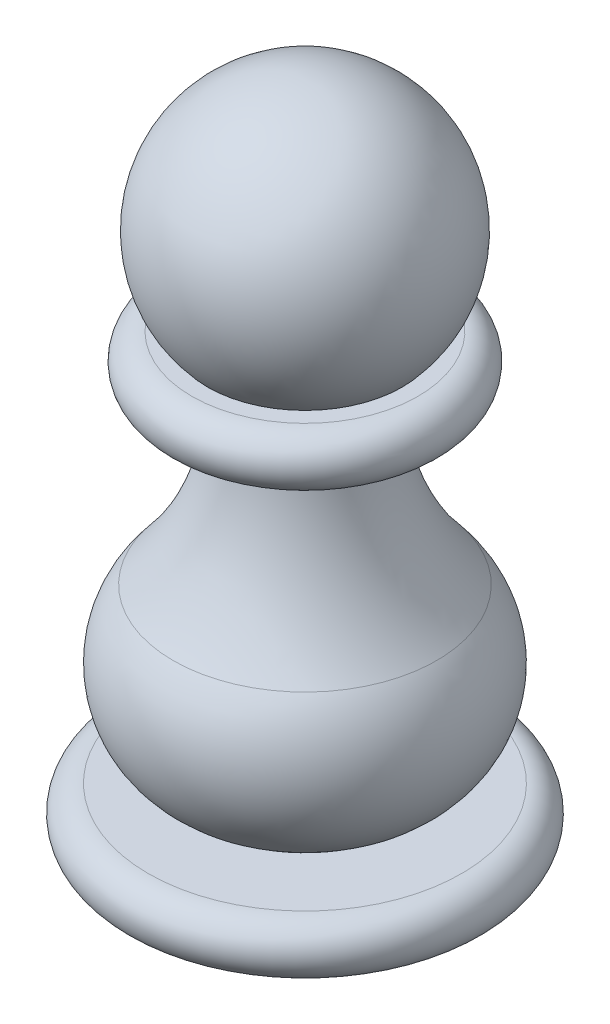
ISO-10303-21;
HEADER;
FILE_DESCRIPTION(('STEP AP214'),'2;1');
FILE_NAME('part.step','',(''),(''),'','','');
FILE_SCHEMA(('AUTOMOTIVE_DESIGN { 1 0 10303 214 1 1 1 1 }'));
ENDSEC;
DATA;
#1=APPLICATION_CONTEXT('core data for automotive mechanical design processes');
#2=APPLICATION_PROTOCOL_DEFINITION('international standard','automotive_design',2000,#1);
#3=PRODUCT_CONTEXT('',#1,'mechanical');
#4=PRODUCT('Part','Part','',(#3));
#5=PRODUCT_RELATED_PRODUCT_CATEGORY('part','',(#4));
#6=PRODUCT_DEFINITION_FORMATION('','',#4);
#7=PRODUCT_DEFINITION_CONTEXT('part definition',#1,'design');
#8=PRODUCT_DEFINITION('design','',#6,#7);
#9=PRODUCT_DEFINITION_SHAPE('','',#8);
#10=(LENGTH_UNIT() NAMED_UNIT(*) SI_UNIT(.MILLI.,.METRE.));
#11=(NAMED_UNIT(*) PLANE_ANGLE_UNIT() SI_UNIT($,.RADIAN.));
#12=(NAMED_UNIT(*) SI_UNIT($,.STERADIAN.) SOLID_ANGLE_UNIT());
#13=UNCERTAINTY_MEASURE_WITH_UNIT(LENGTH_MEASURE(1.E-05),#10,'distance_accuracy_value','');
#14=(GEOMETRIC_REPRESENTATION_CONTEXT(3) GLOBAL_UNCERTAINTY_ASSIGNED_CONTEXT((#13)) GLOBAL_UNIT_ASSIGNED_CONTEXT((#10,
#11,#12)) REPRESENTATION_CONTEXT('',''));
#15=CARTESIAN_POINT('',(0.,0.,0.));
#16=DIRECTION('',(0.,0.,1.));
#17=DIRECTION('',(1.,0.,0.));
#18=AXIS2_PLACEMENT_3D('',#15,#16,#17);
#19=CARTESIAN_POINT('',(0.,0.,0.));
#20=DIRECTION('',(0.,1.,0.));
#21=DIRECTION('',(0.,0.,1.));
#22=AXIS2_PLACEMENT_3D('',#19,#20,#21);
#23=PLANE('',#22);
#24=CARTESIAN_POINT('',(0.,0.,0.));
#25=DIRECTION('',(0.,1.,0.));
#26=DIRECTION('',(0.,0.,1.));
#27=AXIS2_PLACEMENT_3D('',#24,#25,#26);
#28=CIRCLE('',#27,18.);
#29=CARTESIAN_POINT('',(0.,0.,18.));
#30=VERTEX_POINT('',#29);
#31=EDGE_CURVE('E10',#30,#30,#28,.T.);
#32=ORIENTED_EDGE('',*,*,#31,.F.);
#33=EDGE_LOOP('',(#32));
#34=FACE_BOUND('',#33,.T.);
#35=ADVANCED_FACE('F43',(#34),#23,.F.);
#36=CARTESIAN_POINT('',(0.,2.99903308163265,0.));
#37=DIRECTION('',(0.,1.,0.));
#38=DIRECTION('',(0.,0.,1.));
#39=AXIS2_PLACEMENT_3D('',#36,#37,#38);
#40=TOROIDAL_SURFACE('',#39,18.,2.99903308163265);
#41=CARTESIAN_POINT('',(0.,5.99806616326531,0.));
#42=DIRECTION('',(0.,1.,0.));
#43=DIRECTION('',(0.,0.,1.));
#44=AXIS2_PLACEMENT_3D('',#41,#42,#43);
#45=CIRCLE('',#44,18.);
#46=CARTESIAN_POINT('',(0.,5.99806616326531,18.));
#47=VERTEX_POINT('',#46);
#48=EDGE_CURVE('E50',#47,#47,#45,.T.);
#49=ORIENTED_EDGE('',*,*,#48,.F.);
#50=EDGE_LOOP('',(#49));
#51=FACE_BOUND('',#50,.T.);
#52=ORIENTED_EDGE('',*,*,#31,.T.);
#53=EDGE_LOOP('',(#52));
#54=FACE_BOUND('',#53,.T.);
#55=ADVANCED_FACE('F117',(#51,#54),#40,.T.);
#56=CARTESIAN_POINT('',(18.,5.99806616326531,0.));
#57=DIRECTION('',(0.,-1.,0.));
#58=DIRECTION('',(0.,0.,-1.));
#59=AXIS2_PLACEMENT_3D('',#56,#57,#58);
#60=PLANE('',#59);
#61=CARTESIAN_POINT('',(0.,5.99806616326531,0.));
#62=DIRECTION('',(0.,1.,0.));
#63=DIRECTION('',(0.,0.,1.));
#64=AXIS2_PLACEMENT_3D('',#61,#62,#63);
#65=CIRCLE('',#64,6.);
#66=CARTESIAN_POINT('',(0.,5.99806616326531,6.));
#67=VERTEX_POINT('',#66);
#68=EDGE_CURVE('E55',#67,#67,#65,.T.);
#69=ORIENTED_EDGE('',*,*,#68,.F.);
#70=EDGE_LOOP('',(#69));
#71=FACE_BOUND('',#70,.T.);
#72=ORIENTED_EDGE('',*,*,#48,.T.);
#73=EDGE_LOOP('',(#72));
#74=FACE_BOUND('',#73,.T.);
#75=ADVANCED_FACE('F112',(#71,#74),#60,.F.);
#76=CARTESIAN_POINT('',(0.,17.9980661632653,0.));
#77=DIRECTION('',(0.,1.,0.));
#78=DIRECTION('',(0.,0.,1.));
#79=AXIS2_PLACEMENT_3D('',#76,#77,#78);
#80=DEGENERATE_TOROIDAL_SURFACE('',#79,6.,12.,.T.);
#81=CARTESIAN_POINT('',(0.,25.7705631516605,0.));
#82=DIRECTION('',(0.,1.,0.));
#83=DIRECTION('',(0.,0.,1.));
#84=AXIS2_PLACEMENT_3D('',#81,#82,#83);
#85=CIRCLE('',#84,15.1426632096664);
#86=CARTESIAN_POINT('',(0.,25.7705631516605,15.1426632096664));
#87=VERTEX_POINT('',#86);
#88=EDGE_CURVE('E60',#87,#87,#85,.T.);
#89=ORIENTED_EDGE('',*,*,#88,.F.);
#90=EDGE_LOOP('',(#89));
#91=FACE_BOUND('',#90,.T.);
#92=ORIENTED_EDGE('',*,*,#68,.T.);
#93=EDGE_LOOP('',(#92));
#94=FACE_BOUND('',#93,.T.);
#95=ADVANCED_FACE('F106',(#91,#94),#80,.T.);
#96=CARTESIAN_POINT('',(0.,45.2018056226485,0.));
#97=DIRECTION('',(0.,1.,0.));
#98=DIRECTION('',(0.,0.,1.));
#99=AXIS2_PLACEMENT_3D('',#96,#97,#98);
#100=TOROIDAL_SURFACE('',#99,37.9993212338324,30.);
#101=CARTESIAN_POINT('',(0.,45.,0.));
#102=DIRECTION('',(0.,1.,0.));
#103=DIRECTION('',(0.,0.,1.));
#104=AXIS2_PLACEMENT_3D('',#101,#102,#103);
#105=CIRCLE('',#104,8.);
#106=CARTESIAN_POINT('',(0.,45.,8.));
#107=VERTEX_POINT('',#106);
#108=EDGE_CURVE('E66',#107,#107,#105,.T.);
#109=ORIENTED_EDGE('',*,*,#108,.F.);
#110=EDGE_LOOP('',(#109));
#111=FACE_BOUND('',#110,.T.);
#112=ORIENTED_EDGE('',*,*,#88,.T.);
#113=EDGE_LOOP('',(#112));
#114=FACE_BOUND('',#113,.T.);
#115=ADVANCED_FACE('F100',(#111,#114),#100,.F.);
#116=CARTESIAN_POINT('',(7.99999999999999,45.,0.));
#117=DIRECTION('',(0.,1.,0.));
#118=DIRECTION('',(0.,0.,1.));
#119=AXIS2_PLACEMENT_3D('',#116,#117,#118);
#120=PLANE('',#119);
#121=CARTESIAN_POINT('',(0.,45.,0.));
#122=DIRECTION('',(0.,1.,0.));
#123=DIRECTION('',(0.,0.,1.));
#124=AXIS2_PLACEMENT_3D('',#121,#122,#123);
#125=CIRCLE('',#124,13.);
#126=CARTESIAN_POINT('',(0.,45.,13.));
#127=VERTEX_POINT('',#126);
#128=EDGE_CURVE('E70',#127,#127,#125,.T.);
#129=ORIENTED_EDGE('',*,*,#128,.F.);
#130=EDGE_LOOP('',(#129));
#131=FACE_BOUND('',#130,.T.);
#132=ORIENTED_EDGE('',*,*,#108,.T.);
#133=EDGE_LOOP('',(#132));
#134=FACE_BOUND('',#133,.T.);
#135=ADVANCED_FACE('F94',(#131,#134),#120,.F.);
#136=CARTESIAN_POINT('',(0.,48.,0.));
#137=DIRECTION('',(0.,1.,0.));
#138=DIRECTION('',(0.,0.,1.));
#139=AXIS2_PLACEMENT_3D('',#136,#137,#138);
#140=TOROIDAL_SURFACE('',#139,13.,3.);
#141=CARTESIAN_POINT('',(0.,51.,0.));
#142=DIRECTION('',(0.,1.,0.));
#143=DIRECTION('',(0.,0.,1.));
#144=AXIS2_PLACEMENT_3D('',#141,#142,#143);
#145=CIRCLE('',#144,13.);
#146=CARTESIAN_POINT('',(0.,51.,13.));
#147=VERTEX_POINT('',#146);
#148=EDGE_CURVE('E74',#147,#147,#145,.T.);
#149=ORIENTED_EDGE('',*,*,#148,.F.);
#150=EDGE_LOOP('',(#149));
#151=FACE_BOUND('',#150,.T.);
#152=ORIENTED_EDGE('',*,*,#128,.T.);
#153=EDGE_LOOP('',(#152));
#154=FACE_BOUND('',#153,.T.);
#155=ADVANCED_FACE('F88',(#151,#154),#140,.T.);
#156=CARTESIAN_POINT('',(13.,51.,0.));
#157=DIRECTION('',(0.,-1.,0.));
#158=DIRECTION('',(0.,0.,-1.));
#159=AXIS2_PLACEMENT_3D('',#156,#157,#158);
#160=PLANE('',#159);
#161=CARTESIAN_POINT('',(0.,51.,0.));
#162=DIRECTION('',(0.,1.,0.));
#163=DIRECTION('',(0.,0.,1.));
#164=AXIS2_PLACEMENT_3D('',#161,#162,#163);
#165=CIRCLE('',#164,11.1803398874989);
#166=CARTESIAN_POINT('',(0.,51.,11.1803398874989));
#167=VERTEX_POINT('',#166);
#168=EDGE_CURVE('E78',#167,#167,#165,.T.);
#169=ORIENTED_EDGE('',*,*,#168,.F.);
#170=EDGE_LOOP('',(#169));
#171=FACE_BOUND('',#170,.T.);
#172=ORIENTED_EDGE('',*,*,#148,.T.);
#173=EDGE_LOOP('',(#172));
#174=FACE_BOUND('',#173,.T.);
#175=ADVANCED_FACE('F85',(#171,#174),#160,.F.);
#176=CARTESIAN_POINT('',(0.,61.,0.));
#177=DIRECTION('',(0.,1.,0.));
#178=DIRECTION('',(1.,0.,0.));
#179=AXIS2_PLACEMENT_3D('',#176,#177,#178);
#180=SPHERICAL_SURFACE('',#179,15.);
#181=ORIENTED_EDGE('',*,*,#168,.T.);
#182=EDGE_LOOP('',(#181));
#183=FACE_BOUND('',#182,.T.);
#184=ADVANCED_FACE('F83',(#183),#180,.T.);
#185=CLOSED_SHELL('',(#35,#55,#75,#95,#115,#135,#155,#175,#184));
#186=MANIFOLD_SOLID_BREP('B2',#185);
#187=ADVANCED_BREP_SHAPE_REPRESENTATION('',(#18,#186),#14);
#188=SHAPE_DEFINITION_REPRESENTATION(#9,#187);
ENDSEC;
END-ISO-10303-21;
